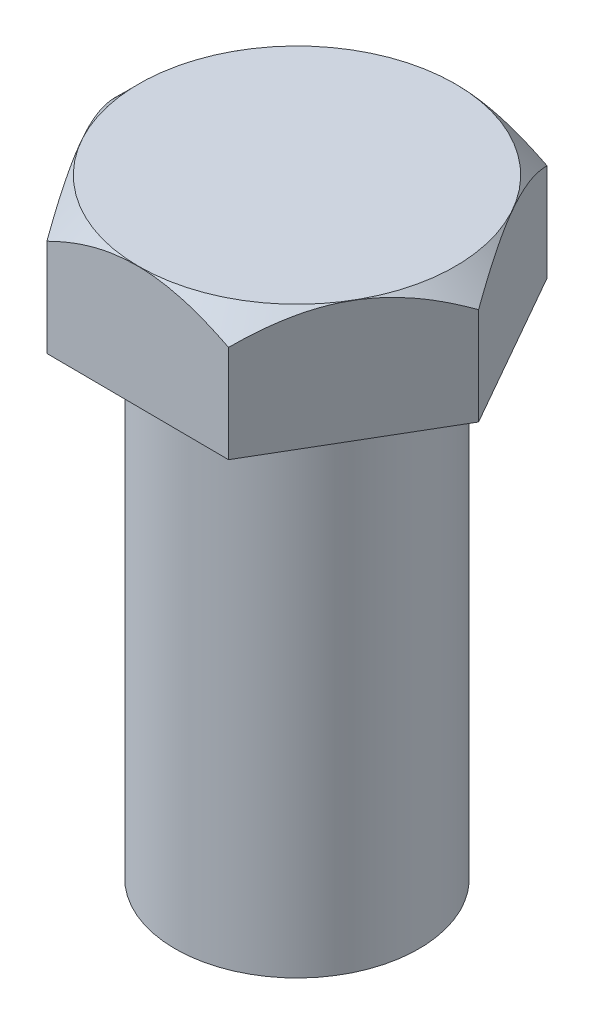
ISO-10303-21;
HEADER;
FILE_DESCRIPTION(('STEP AP214'),'2;1');
FILE_NAME('part.step','',(''),(''),'','','');
FILE_SCHEMA(('AUTOMOTIVE_DESIGN { 1 0 10303 214 1 1 1 1 }'));
ENDSEC;
DATA;
#1=APPLICATION_CONTEXT('core data for automotive mechanical design processes');
#2=APPLICATION_PROTOCOL_DEFINITION('international standard','automotive_design',2000,#1);
#3=PRODUCT_CONTEXT('',#1,'mechanical');
#4=PRODUCT('Part','Part','',(#3));
#5=PRODUCT_RELATED_PRODUCT_CATEGORY('part','',(#4));
#6=PRODUCT_DEFINITION_FORMATION('','',#4);
#7=PRODUCT_DEFINITION_CONTEXT('part definition',#1,'design');
#8=PRODUCT_DEFINITION('design','',#6,#7);
#9=PRODUCT_DEFINITION_SHAPE('','',#8);
#10=(LENGTH_UNIT() NAMED_UNIT(*) SI_UNIT(.MILLI.,.METRE.));
#11=(NAMED_UNIT(*) PLANE_ANGLE_UNIT() SI_UNIT($,.RADIAN.));
#12=(NAMED_UNIT(*) SI_UNIT($,.STERADIAN.) SOLID_ANGLE_UNIT());
#13=UNCERTAINTY_MEASURE_WITH_UNIT(LENGTH_MEASURE(1.E-05),#10,'distance_accuracy_value','');
#14=(GEOMETRIC_REPRESENTATION_CONTEXT(3) GLOBAL_UNCERTAINTY_ASSIGNED_CONTEXT((#13)) GLOBAL_UNIT_ASSIGNED_CONTEXT((#10,
#11,#12)) REPRESENTATION_CONTEXT('',''));
#15=CARTESIAN_POINT('',(0.,0.,0.));
#16=DIRECTION('',(0.,0.,1.));
#17=DIRECTION('',(1.,0.,0.));
#18=AXIS2_PLACEMENT_3D('',#15,#16,#17);
#19=CARTESIAN_POINT('',(-3.38741150898086,12.,1.92689991147024));
#20=DIRECTION('',(-0.869210198473838,0.,0.494442747817249));
#21=DIRECTION('',(0.494442747817249,0.,0.869210198473838));
#22=AXIS2_PLACEMENT_3D('',#19,#20,#21);
#23=PLANE('',#22);
#24=DIRECTION('',(0.,1.,0.));
#25=VECTOR('',#24,1.);
#26=CARTESIAN_POINT('',(-2.27491532639205,12.,3.88262285803638));
#27=LINE('',#26,#25);
#28=CARTESIAN_POINT('',(-2.27491532639205,12.,3.88262285803638));
#29=VERTEX_POINT('',#28);
#30=CARTESIAN_POINT('',(-2.27491532639205,14.395,3.88262285803638));
#31=VERTEX_POINT('',#30);
#32=EDGE_CURVE('E160',#29,#31,#27,.T.);
#33=ORIENTED_EDGE('',*,*,#32,.T.);
#34=CARTESIAN_POINT('',(-2.27480155811167,14.3948849486178,3.88282285803638));
#35=CARTESIAN_POINT('',(-2.31306092551852,14.4335703988287,3.81556444948655));
#36=CARTESIAN_POINT('',(-2.35161306696474,14.4710690009602,3.74779135610821));
#37=CARTESIAN_POINT('',(-2.42936320726318,14.543330733342,3.61110977835525));
#38=CARTESIAN_POINT('',(-2.46856154494327,14.5780923694987,3.54220069833503));
#39=CARTESIAN_POINT('',(-2.58758053977023,14.6780256287268,3.33297015633113));
#40=CARTESIAN_POINT('',(-2.6684127409146,14.7384192249591,3.19087044122773));
#41=CARTESIAN_POINT('',(-2.83138574638918,14.8418463965576,2.90437053995545));
#42=CARTESIAN_POINT('',(-2.91348538454957,14.8851404262662,2.76004272223528));
#43=CARTESIAN_POINT('',(-3.07949755410774,14.9518496625736,2.46820009437241));
#44=CARTESIAN_POINT('',(-3.16340500115676,14.9753146402362,2.32069422230757));
#45=CARTESIAN_POINT('',(-3.30801604965155,14.9964855742927,2.06647389302058));
#46=CARTESIAN_POINT('',(-3.3685333333993,14.9996188499743,1.96008697471772));
#47=CARTESIAN_POINT('',(-3.48946967878921,14.9943372000237,1.74748580857033));
#48=CARTESIAN_POINT('',(-3.54988869856692,14.9859182261118,1.64127163432182));
#49=CARTESIAN_POINT('',(-3.67015425679536,14.9580122881343,1.42984968466477));
#50=CARTESIAN_POINT('',(-3.73000007870121,14.9385129450965,1.32464316891295));
#51=CARTESIAN_POINT('',(-3.84866390388889,14.8895107015039,1.11603700065912));
#52=CARTESIAN_POINT('',(-3.90748198561205,14.8600085679409,1.01263721026045));
#53=CARTESIAN_POINT('',(-4.01189848083281,14.7993108167485,0.8290772674047));
#54=CARTESIAN_POINT('',(-4.05772806757026,14.7697110674808,0.74851072181396));
#55=CARTESIAN_POINT('',(-4.14856451254315,14.7057413233769,0.58882395380674));
#56=CARTESIAN_POINT('',(-4.19357134569815,14.6713711833958,0.509703775480655));
#57=CARTESIAN_POINT('',(-4.28262048578962,14.5986311550648,0.353159016609126));
#58=CARTESIAN_POINT('',(-4.32666532544825,14.5602738442614,0.275729983641334));
#59=CARTESIAN_POINT('',(-4.41393934111822,14.4800631676673,0.122305821153382));
#60=CARTESIAN_POINT('',(-4.45716899788176,14.4382119468201,0.0463098464904385));
#61=CARTESIAN_POINT('',(-4.50002145985004,14.3948849486178,-0.0290230350958886));
#62=B_SPLINE_CURVE_WITH_KNOTS('',3,(#34,#35,#36,#37,#38,#39,#40,#41,#42,#43,#44,#45,#46,#47,#48,
#49,#50,#51,#52,#53,#54,#55,#56,#57,#58,#59,#60,#61),.UNSPECIFIED.,.F.,.F.,(4,2,2,2,2,2,2,2,2,2,
2,2,2,4),(0.,0.259511356759491,0.519163410942877,1.04127110701184,1.55508749855843,
2.0676103438585,2.43439729579002,2.80131281449566,3.16863905888255,3.53593714387571,
3.82770299633271,4.11947772806444,4.41035848645958,4.70106196546155),.UNSPECIFIED.);
#63=CARTESIAN_POINT('',(-4.49990769156967,14.395,-0.0288230350958885));
#64=VERTEX_POINT('',#63);
#65=EDGE_CURVE('E80',#31,#64,#62,.T.);
#66=ORIENTED_EDGE('',*,*,#65,.T.);
#67=DIRECTION('',(0.,1.,0.));
#68=VECTOR('',#67,1.);
#69=CARTESIAN_POINT('',(-4.49990769156967,12.,-0.0288230350958887));
#70=LINE('',#69,#68);
#71=CARTESIAN_POINT('',(-4.49990769156967,12.,-0.0288230350958887));
#72=VERTEX_POINT('',#71);
#73=EDGE_CURVE('E159',#72,#64,#70,.T.);
#74=ORIENTED_EDGE('',*,*,#73,.F.);
#75=DIRECTION('',(0.494442747817249,0.,0.869210198473838));
#76=VECTOR('',#75,1.);
#77=CARTESIAN_POINT('',(-3.38741150898086,12.,1.92689991147024));
#78=LINE('',#77,#76);
#79=EDGE_CURVE('E156',#72,#29,#78,.T.);
#80=ORIENTED_EDGE('',*,*,#79,.T.);
#81=EDGE_LOOP('',(#33,#66,#74,#80));
#82=FACE_BOUND('',#81,.T.);
#83=ADVANCED_FACE('F60',(#82),#23,.T.);
#84=CARTESIAN_POINT('',(-3.36245002837364,12.,-1.97013446411408));
#85=DIRECTION('',(-0.862805079563639,0.,-0.505536739198233));
#86=DIRECTION('',(-0.505536739198233,0.,0.862805079563639));
#87=AXIS2_PLACEMENT_3D('',#84,#85,#86);
#88=PLANE('',#87);
#89=ORIENTED_EDGE('',*,*,#73,.T.);
#90=CARTESIAN_POINT('',(-4.50002487603025,14.3948840944894,-0.0286230350958887));
#91=CARTESIAN_POINT('',(-4.46090704327545,14.4335695924587,-0.0953858679137221));
#92=CARTESIAN_POINT('',(-4.42148986708007,14.4710682417424,-0.162659593454152));
#93=CARTESIAN_POINT('',(-4.34199516509972,14.5433300666852,-0.298334070398852));
#94=CARTESIAN_POINT('',(-4.30191729288356,14.5780917482476,-0.366735413060992));
#95=CARTESIAN_POINT('',(-4.18022774129432,14.6780251414279,-0.574424301127837));
#96=CARTESIAN_POINT('',(-4.09758182004704,14.7384188224181,-0.715476998446058));
#97=CARTESIAN_POINT('',(-3.93095201125394,14.8418461431297,-0.999865914791532));
#98=CARTESIAN_POINT('',(-3.84701021368965,14.8851402379352,-1.14313029838715));
#99=CARTESIAN_POINT('',(-3.67727304491054,14.951849578377,-1.4328225799919));
#100=CARTESIAN_POINT('',(-3.59148287214697,14.9753145952547,-1.57924160574747));
#101=CARTESIAN_POINT('',(-3.44362706594206,14.9964855619308,-1.83158872662912));
#102=CARTESIAN_POINT('',(-3.38175193144143,14.9996188472302,-1.93719169513047));
#103=CARTESIAN_POINT('',(-3.25810208792279,14.9943372154266,-2.14822623486409));
#104=CARTESIAN_POINT('',(-3.19632742170845,14.9859182500397,-2.25365773304286));
#105=CARTESIAN_POINT('',(-3.07336341509191,14.9580123274919,-2.46352174743775));
#106=CARTESIAN_POINT('',(-3.0121748073136,14.9385129913243,-2.56795301327668));
#107=CARTESIAN_POINT('',(-2.89084847180137,14.8895107596688,-2.77502199649403));
#108=CARTESIAN_POINT('',(-2.83071066386628,14.8600086311714,-2.87765985075268));
#109=CARTESIAN_POINT('',(-2.7239512463406,14.7993108391234,-3.05986731578974));
#110=CARTESIAN_POINT('',(-2.67709327805278,14.7697110344319,-3.1398403225407));
#111=CARTESIAN_POINT('',(-2.58421853290407,14.705741162503,-3.29835066543799));
#112=CARTESIAN_POINT('',(-2.53820178168818,14.6713709501104,-3.3768879578157));
#113=CARTESIAN_POINT('',(-2.44715445007757,14.5986307636867,-3.53227943404932));
#114=CARTESIAN_POINT('',(-2.40212128012663,14.5602733672285,-3.60913803752916));
#115=CARTESIAN_POINT('',(-2.31288890828269,14.4800625090866,-3.76143190208699));
#116=CARTESIAN_POINT('',(-2.26868921484499,14.4382111923702,-3.8368680020897));
#117=CARTESIAN_POINT('',(-2.22487518071703,14.3948840944894,-3.91164589313227));
#118=B_SPLINE_CURVE_WITH_KNOTS('',3,(#90,#91,#92,#93,#94,#95,#96,#97,#98,#99,#100,#101,#102,
#103,#104,#105,#106,#107,#108,#109,#110,#111,#112,#113,#114,#115,#116,#117),.UNSPECIFIED.,.F.,
.F.,(4,2,2,2,2,2,2,2,2,2,2,2,2,4),(0.,0.259511559008754,0.519163815738846,1.04127192562337,
1.55508870956662,2.06761194333773,2.43439891080444,2.80131444517624,3.16864070633625,
3.53593880815574,3.82770519922407,4.1194804701856,4.41036176719606,4.70106578305072),.UNSPECIFIED.);
#119=CARTESIAN_POINT('',(-2.22499236517762,14.395,-3.91144589313227));
#120=VERTEX_POINT('',#119);
#121=EDGE_CURVE('E196',#64,#120,#118,.T.);
#122=ORIENTED_EDGE('',*,*,#121,.T.);
#123=DIRECTION('',(0.,1.,0.));
#124=VECTOR('',#123,1.);
#125=CARTESIAN_POINT('',(-2.22499236517762,12.,-3.91144589313227));
#126=LINE('',#125,#124);
#127=CARTESIAN_POINT('',(-2.22499236517762,12.,-3.91144589313227));
#128=VERTEX_POINT('',#127);
#129=EDGE_CURVE('E152',#128,#120,#126,.T.);
#130=ORIENTED_EDGE('',*,*,#129,.F.);
#131=DIRECTION('',(-0.505536739198233,0.,0.862805079563639));
#132=VECTOR('',#131,1.);
#133=CARTESIAN_POINT('',(-3.36245002837364,12.,-1.97013446411408));
#134=LINE('',#133,#132);
#135=EDGE_CURVE('E87',#128,#72,#134,.T.);
#136=ORIENTED_EDGE('',*,*,#135,.T.);
#137=EDGE_LOOP('',(#89,#122,#130,#136));
#138=FACE_BOUND('',#137,.T.);
#139=ADVANCED_FACE('F180',(#138),#88,.T.);
#140=CARTESIAN_POINT('',(0.0249614806072157,12.,-3.89703437558432));
#141=DIRECTION('',(0.00640511891019895,0.,-0.999979487015482));
#142=DIRECTION('',(-0.999979487015482,0.,-0.00640511891019895));
#143=AXIS2_PLACEMENT_3D('',#140,#141,#142);
#144=PLANE('',#143);
#145=ORIENTED_EDGE('',*,*,#129,.T.);
#146=CARTESIAN_POINT('',(-2.22519236517762,14.3948999946153,-3.91144717418233));
#147=CARTESIAN_POINT('',(-2.14781609825965,14.4335846035393,-3.91095155982536));
#148=CARTESIAN_POINT('',(-2.0698477254691,14.4710823750586,-3.91045215288208));
#149=CARTESIAN_POINT('',(-1.91260480323778,14.5433424769289,-3.90944497260712));
#150=CARTESIAN_POINT('',(-1.83332956857017,14.5781033132387,-3.90893719488641));
#151=CARTESIAN_POINT('',(-1.59262404669533,14.6780342128272,-3.90739541576997));
#152=CARTESIAN_POINT('',(-1.42914802727215,14.7384263160017,-3.90634831094735));
#153=CARTESIAN_POINT('',(-1.09954947299966,14.841850860887,-3.90423714970839));
#154=CARTESIAN_POINT('',(-0.93351018887359,14.8851437438743,-3.90317362653376));
#155=CARTESIAN_POINT('',(-0.597765292438725,14.9518511457845,-3.90102309643481));
#156=CARTESIAN_POINT('',(-0.428069962100611,14.9753154326429,-3.89993615536909));
#157=CARTESIAN_POINT('',(-0.135605513677783,14.9964857920651,-3.8980628473728));
#158=CARTESIAN_POINT('',(-0.0132131848148659,14.9996188983138,-3.89727889387151));
#159=CARTESIAN_POINT('',(0.23137280854664,14.9943369286694,-3.89571225936391));
#160=CARTESIAN_POINT('',(0.353566388372993,14.9859178045729,-3.89492957889994));
#161=CARTESIAN_POINT('',(0.596795723460335,14.9580115947674,-3.89337163412816));
#162=CARTESIAN_POINT('',(0.717830029610178,14.9385121306962,-3.89259637910227));
#163=CARTESIAN_POINT('',(0.95781993897169,14.8895096767992,-3.89105918366309));
#164=CARTESIAN_POINT('',(1.07677570083174,14.860007453989,-3.89029724223363));
#165=CARTESIAN_POINT('',(1.28794833354216,14.7993104224913,-3.8889446286644));
#166=CARTESIAN_POINT('',(1.38063278868152,14.7697116495567,-3.88835096153022));
#167=CARTESIAN_POINT('',(1.56433788896369,14.7057441571848,-3.88717428438134));
#168=CARTESIAN_POINT('',(1.65535848344682,14.6713752927851,-3.88659127469113));
#169=CARTESIAN_POINT('',(1.83544908928129,14.5986380493729,-3.88543774928391));
#170=CARTESIAN_POINT('',(1.92452422267985,14.5602822474425,-3.88486720075889));
#171=CARTESIAN_POINT('',(2.10102496779205,14.480074768946,-3.88373666930814));
#172=CARTESIAN_POINT('',(2.18845155159893,14.4382252369052,-3.88317668015589));
#173=CARTESIAN_POINT('',(2.27511532639204,14.3948999946153,-3.88262157698631));
#174=B_SPLINE_CURVE_WITH_KNOTS('',3,(#146,#147,#148,#149,#150,#151,#152,#153,#154,#155,#156,
#157,#158,#159,#160,#161,#162,#163,#164,#165,#166,#167,#168,#169,#170,#171,#172,#173),
.UNSPECIFIED.,.F.,.F.,(4,2,2,2,2,2,2,2,2,2,2,2,2,4),(0.,0.259507794039297,0.519156280262991,
1.04125668677009,1.55506616605299,2.06758216823974,2.4343688465297,2.80128408928681,
3.16861003822499,3.53590782683231,3.82766419117663,4.11942942390167,4.41030069411634,
4.7009947159864),.UNSPECIFIED.);
#175=CARTESIAN_POINT('',(2.27491532639204,14.395,-3.88262285803638));
#176=VERTEX_POINT('',#175);
#177=EDGE_CURVE('E218',#120,#176,#174,.T.);
#178=ORIENTED_EDGE('',*,*,#177,.T.);
#179=DIRECTION('',(0.,1.,0.));
#180=VECTOR('',#179,1.);
#181=CARTESIAN_POINT('',(2.27491532639204,12.,-3.88262285803638));
#182=LINE('',#181,#180);
#183=CARTESIAN_POINT('',(2.27491532639204,12.,-3.88262285803638));
#184=VERTEX_POINT('',#183);
#185=EDGE_CURVE('E147',#184,#176,#182,.T.);
#186=ORIENTED_EDGE('',*,*,#185,.F.);
#187=DIRECTION('',(-0.999979487015482,0.,-0.00640511891019895));
#188=VECTOR('',#187,1.);
#189=CARTESIAN_POINT('',(0.0249614806072157,12.,-3.89703437558432));
#190=LINE('',#189,#188);
#191=EDGE_CURVE('E150',#184,#128,#190,.T.);
#192=ORIENTED_EDGE('',*,*,#191,.T.);
#193=EDGE_LOOP('',(#145,#178,#186,#192));
#194=FACE_BOUND('',#193,.T.);
#195=ADVANCED_FACE('F186',(#194),#144,.T.);
#196=CARTESIAN_POINT('',(3.38741150898086,12.,-1.92689991147024));
#197=DIRECTION('',(0.869210198473838,0.,-0.494442747817249));
#198=DIRECTION('',(-0.494442747817249,0.,-0.869210198473838));
#199=AXIS2_PLACEMENT_3D('',#196,#197,#198);
#200=PLANE('',#199);
#201=ORIENTED_EDGE('',*,*,#185,.T.);
#202=CARTESIAN_POINT('',(2.27480155811167,14.3948849486178,-3.88282285803638));
#203=CARTESIAN_POINT('',(2.31306092551852,14.4335703988287,-3.81556444948655));
#204=CARTESIAN_POINT('',(2.35161306696474,14.4710690009602,-3.74779135610822));
#205=CARTESIAN_POINT('',(2.42936320726318,14.543330733342,-3.61110977835525));
#206=CARTESIAN_POINT('',(2.46856154494326,14.5780923694987,-3.54220069833503));
#207=CARTESIAN_POINT('',(2.58758053977023,14.6780256287268,-3.33297015633113));
#208=CARTESIAN_POINT('',(2.6684127409146,14.7384192249591,-3.19087044122773));
#209=CARTESIAN_POINT('',(2.83138574638917,14.8418463965576,-2.90437053995546));
#210=CARTESIAN_POINT('',(2.91348538454957,14.8851404262662,-2.76004272223528));
#211=CARTESIAN_POINT('',(3.07949755410773,14.9518496625736,-2.46820009437242));
#212=CARTESIAN_POINT('',(3.16340500115676,14.9753146402362,-2.32069422230757));
#213=CARTESIAN_POINT('',(3.30801604965155,14.9964855742927,-2.06647389302058));
#214=CARTESIAN_POINT('',(3.3685333333993,14.9996188499743,-1.96008697471772));
#215=CARTESIAN_POINT('',(3.48946967878921,14.9943372000237,-1.74748580857033));
#216=CARTESIAN_POINT('',(3.54988869856691,14.9859182261118,-1.64127163432182));
#217=CARTESIAN_POINT('',(3.67015425679536,14.9580122881343,-1.42984968466477));
#218=CARTESIAN_POINT('',(3.7300000787012,14.9385129450965,-1.32464316891295));
#219=CARTESIAN_POINT('',(3.84866390388888,14.8895107015039,-1.11603700065913));
#220=CARTESIAN_POINT('',(3.90748198561205,14.8600085679409,-1.01263721026046));
#221=CARTESIAN_POINT('',(4.01189848083281,14.7993108167485,-0.829077267404702));
#222=CARTESIAN_POINT('',(4.05772806757025,14.7697110674808,-0.74851072181396));
#223=CARTESIAN_POINT('',(4.14856451254315,14.7057413233769,-0.58882395380674));
#224=CARTESIAN_POINT('',(4.19357134569815,14.6713711833958,-0.509703775480656));
#225=CARTESIAN_POINT('',(4.28262048578962,14.5986311550648,-0.353159016609127));
#226=CARTESIAN_POINT('',(4.32666532544825,14.5602738442614,-0.275729983641335));
#227=CARTESIAN_POINT('',(4.41393934111822,14.4800631676673,-0.122305821153384));
#228=CARTESIAN_POINT('',(4.45716899788176,14.4382119468201,-0.0463098464904401));
#229=CARTESIAN_POINT('',(4.50002145985003,14.3948849486178,0.0290230350958867));
#230=B_SPLINE_CURVE_WITH_KNOTS('',3,(#202,#203,#204,#205,#206,#207,#208,#209,#210,#211,#212,
#213,#214,#215,#216,#217,#218,#219,#220,#221,#222,#223,#224,#225,#226,#227,#228,#229),
.UNSPECIFIED.,.F.,.F.,(4,2,2,2,2,2,2,2,2,2,2,2,2,4),(0.,0.259511356759491,0.519163410942878,
1.04127110701184,1.55508749855843,2.0676103438585,2.43439729579002,2.80131281449565,
3.16863905888255,3.53593714387571,3.82770299633271,4.11947772806444,4.41035848645958,
4.70106196546155),.UNSPECIFIED.);
#231=CARTESIAN_POINT('',(4.49990769156967,14.395,0.0288230350958868));
#232=VERTEX_POINT('',#231);
#233=EDGE_CURVE('E132',#176,#232,#230,.T.);
#234=ORIENTED_EDGE('',*,*,#233,.T.);
#235=DIRECTION('',(0.,1.,0.));
#236=VECTOR('',#235,1.);
#237=CARTESIAN_POINT('',(4.49990769156967,12.,0.0288230350958866));
#238=LINE('',#237,#236);
#239=CARTESIAN_POINT('',(4.49990769156967,12.,0.0288230350958866));
#240=VERTEX_POINT('',#239);
#241=EDGE_CURVE('E131',#240,#232,#238,.T.);
#242=ORIENTED_EDGE('',*,*,#241,.F.);
#243=DIRECTION('',(-0.494442747817249,0.,-0.869210198473838));
#244=VECTOR('',#243,1.);
#245=CARTESIAN_POINT('',(3.38741150898086,12.,-1.92689991147024));
#246=LINE('',#245,#244);
#247=EDGE_CURVE('E145',#240,#184,#246,.T.);
#248=ORIENTED_EDGE('',*,*,#247,.T.);
#249=EDGE_LOOP('',(#201,#234,#242,#248));
#250=FACE_BOUND('',#249,.T.);
#251=ADVANCED_FACE('F225',(#250),#200,.T.);
#252=CARTESIAN_POINT('',(3.36245002837364,12.,1.97013446411408));
#253=DIRECTION('',(0.862805079563639,0.,0.505536739198233));
#254=DIRECTION('',(0.505536739198233,0.,-0.862805079563639));
#255=AXIS2_PLACEMENT_3D('',#252,#253,#254);
#256=PLANE('',#255);
#257=ORIENTED_EDGE('',*,*,#241,.T.);
#258=CARTESIAN_POINT('',(4.50002487603025,14.3948840944894,0.0286230350958866));
#259=CARTESIAN_POINT('',(4.46090704327545,14.4335695924587,0.0953858679137199));
#260=CARTESIAN_POINT('',(4.42148986708008,14.4710682417424,0.16265959345415));
#261=CARTESIAN_POINT('',(4.34199516509972,14.5433300666852,0.29833407039885));
#262=CARTESIAN_POINT('',(4.30191729288356,14.5780917482476,0.36673541306099));
#263=CARTESIAN_POINT('',(4.18022774129432,14.6780251414279,0.574424301127834));
#264=CARTESIAN_POINT('',(4.09758182004704,14.7384188224181,0.715476998446056));
#265=CARTESIAN_POINT('',(3.93095201125394,14.8418461431297,0.999865914791531));
#266=CARTESIAN_POINT('',(3.84701021368965,14.8851402379352,1.14313029838714));
#267=CARTESIAN_POINT('',(3.67727304491054,14.951849578377,1.4328225799919));
#268=CARTESIAN_POINT('',(3.59148287214697,14.9753145952547,1.57924160574747));
#269=CARTESIAN_POINT('',(3.44362706594206,14.9964855619308,1.83158872662912));
#270=CARTESIAN_POINT('',(3.38175193144143,14.9996188472302,1.93719169513047));
#271=CARTESIAN_POINT('',(3.25810208792279,14.9943372154266,2.14822623486409));
#272=CARTESIAN_POINT('',(3.19632742170845,14.9859182500397,2.25365773304286));
#273=CARTESIAN_POINT('',(3.07336341509191,14.9580123274919,2.46352174743775));
#274=CARTESIAN_POINT('',(3.0121748073136,14.9385129913243,2.56795301327668));
#275=CARTESIAN_POINT('',(2.89084847180137,14.8895107596688,2.77502199649403));
#276=CARTESIAN_POINT('',(2.83071066386628,14.8600086311714,2.87765985075268));
#277=CARTESIAN_POINT('',(2.7239512463406,14.7993108391234,3.05986731578974));
#278=CARTESIAN_POINT('',(2.67709327805278,14.7697110344319,3.1398403225407));
#279=CARTESIAN_POINT('',(2.58421853290407,14.705741162503,3.298350665438));
#280=CARTESIAN_POINT('',(2.53820178168818,14.6713709501104,3.3768879578157));
#281=CARTESIAN_POINT('',(2.44715445007757,14.5986307636867,3.53227943404933));
#282=CARTESIAN_POINT('',(2.40212128012663,14.5602733672285,3.60913803752916));
#283=CARTESIAN_POINT('',(2.31288890828269,14.4800625090866,3.761431902087));
#284=CARTESIAN_POINT('',(2.26868921484499,14.4382111923702,3.83686800208971));
#285=CARTESIAN_POINT('',(2.22487518071703,14.3948840944894,3.91164589313227));
#286=B_SPLINE_CURVE_WITH_KNOTS('',3,(#258,#259,#260,#261,#262,#263,#264,#265,#266,#267,#268,
#269,#270,#271,#272,#273,#274,#275,#276,#277,#278,#279,#280,#281,#282,#283,#284,#285),
.UNSPECIFIED.,.F.,.F.,(4,2,2,2,2,2,2,2,2,2,2,2,2,4),(0.,0.259511559008756,0.519163815738847,
1.04127192562337,1.55508870956662,2.06761194333773,2.43439891080445,2.80131444517624,
3.16864070633626,3.53593880815574,3.82770519922408,4.11948047018561,4.41036176719607,
4.70106578305073),.UNSPECIFIED.);
#287=CARTESIAN_POINT('',(2.22499236517761,14.395,3.91144589313227));
#288=VERTEX_POINT('',#287);
#289=EDGE_CURVE('E119',#232,#288,#286,.T.);
#290=ORIENTED_EDGE('',*,*,#289,.T.);
#291=DIRECTION('',(0.,1.,0.));
#292=VECTOR('',#291,1.);
#293=CARTESIAN_POINT('',(2.22499236517761,12.,3.91144589313227));
#294=LINE('',#293,#292);
#295=CARTESIAN_POINT('',(2.22499236517761,12.,3.91144589313227));
#296=VERTEX_POINT('',#295);
#297=EDGE_CURVE('E128',#296,#288,#294,.T.);
#298=ORIENTED_EDGE('',*,*,#297,.F.);
#299=DIRECTION('',(0.505536739198233,0.,-0.862805079563639));
#300=VECTOR('',#299,1.);
#301=CARTESIAN_POINT('',(3.36245002837364,12.,1.97013446411408));
#302=LINE('',#301,#300);
#303=EDGE_CURVE('E138',#296,#240,#302,.T.);
#304=ORIENTED_EDGE('',*,*,#303,.T.);
#305=EDGE_LOOP('',(#257,#290,#298,#304));
#306=FACE_BOUND('',#305,.T.);
#307=ADVANCED_FACE('F127',(#306),#256,.T.);
#308=CARTESIAN_POINT('',(-0.0249614806072165,12.,3.89703437558432));
#309=DIRECTION('',(-0.00640511891019914,0.,0.999979487015482));
#310=DIRECTION('',(0.999979487015482,0.,0.00640511891019914));
#311=AXIS2_PLACEMENT_3D('',#308,#309,#310);
#312=PLANE('',#311);
#313=ORIENTED_EDGE('',*,*,#297,.T.);
#314=CARTESIAN_POINT('',(2.22519236517761,14.3948999946153,3.91144717418233));
#315=CARTESIAN_POINT('',(2.14781609825964,14.4335846035393,3.91095155982536));
#316=CARTESIAN_POINT('',(2.06984772546909,14.4710823750586,3.91045215288208));
#317=CARTESIAN_POINT('',(1.91260480323777,14.5433424769289,3.90944497260712));
#318=CARTESIAN_POINT('',(1.83332956857016,14.5781033132387,3.90893719488641));
#319=CARTESIAN_POINT('',(1.59262404669533,14.6780342128272,3.90739541576997));
#320=CARTESIAN_POINT('',(1.42914802727214,14.7384263160017,3.90634831094735));
#321=CARTESIAN_POINT('',(1.09954947299965,14.8418508608871,3.90423714970839));
#322=CARTESIAN_POINT('',(0.933510188873584,14.8851437438743,3.90317362653376));
#323=CARTESIAN_POINT('',(0.597765292438721,14.9518511457845,3.90102309643481));
#324=CARTESIAN_POINT('',(0.428069962100608,14.9753154326429,3.89993615536909));
#325=CARTESIAN_POINT('',(0.13560551367778,14.9964857920651,3.89806284737279));
#326=CARTESIAN_POINT('',(0.013213184814863,14.9996188983138,3.89727889387151));
#327=CARTESIAN_POINT('',(-0.231372808546643,14.9943369286694,3.89571225936391));
#328=CARTESIAN_POINT('',(-0.353566388372995,14.9859178045729,3.89492957889994));
#329=CARTESIAN_POINT('',(-0.596795723460337,14.9580115947674,3.89337163412816));
#330=CARTESIAN_POINT('',(-0.71783002961018,14.9385121306962,3.89259637910227));
#331=CARTESIAN_POINT('',(-0.957819938971692,14.8895096767992,3.89105918366309));
#332=CARTESIAN_POINT('',(-1.07677570083174,14.860007453989,3.89029724223363));
#333=CARTESIAN_POINT('',(-1.28794833354216,14.7993104224913,3.8889446286644));
#334=CARTESIAN_POINT('',(-1.38063278868152,14.7697116495566,3.88835096153022));
#335=CARTESIAN_POINT('',(-1.5643378889637,14.7057441571848,3.88717428438134));
#336=CARTESIAN_POINT('',(-1.65535848344682,14.6713752927851,3.88659127469113));
#337=CARTESIAN_POINT('',(-1.83544908928129,14.5986380493729,3.88543774928391));
#338=CARTESIAN_POINT('',(-1.92452422267985,14.5602822474425,3.88486720075889));
#339=CARTESIAN_POINT('',(-2.10102496779206,14.480074768946,3.88373666930814));
#340=CARTESIAN_POINT('',(-2.18845155159893,14.4382252369052,3.88317668015589));
#341=CARTESIAN_POINT('',(-2.27511532639205,14.3948999946153,3.88262157698631));
#342=B_SPLINE_CURVE_WITH_KNOTS('',3,(#314,#315,#316,#317,#318,#319,#320,#321,#322,#323,#324,
#325,#326,#327,#328,#329,#330,#331,#332,#333,#334,#335,#336,#337,#338,#339,#340,#341),
.UNSPECIFIED.,.F.,.F.,(4,2,2,2,2,2,2,2,2,2,2,2,2,4),(0.,0.259507794039296,0.51915628026299,
1.04125668677008,1.55506616605299,2.06758216823973,2.43436884652969,2.8012840892868,
3.16861003822498,3.5359078268323,3.82766419117662,4.11942942390166,4.41030069411633,
4.70099471598639),.UNSPECIFIED.);
#343=EDGE_CURVE('E13',#288,#31,#342,.T.);
#344=ORIENTED_EDGE('',*,*,#343,.T.);
#345=ORIENTED_EDGE('',*,*,#32,.F.);
#346=DIRECTION('',(0.999979487015482,0.,0.00640511891019914));
#347=VECTOR('',#346,1.);
#348=CARTESIAN_POINT('',(-0.0249614806072165,12.,3.89703437558432));
#349=LINE('',#348,#347);
#350=EDGE_CURVE('E137',#29,#296,#349,.T.);
#351=ORIENTED_EDGE('',*,*,#350,.T.);
#352=EDGE_LOOP('',(#313,#344,#345,#351));
#353=FACE_BOUND('',#352,.T.);
#354=ADVANCED_FACE('F135',(#353),#312,.T.);
#355=CARTESIAN_POINT('',(0.,12.,0.));
#356=DIRECTION('',(0.,1.,0.));
#357=DIRECTION('',(0.,0.,1.));
#358=AXIS2_PLACEMENT_3D('',#355,#356,#357);
#359=PLANE('',#358);
#360=CARTESIAN_POINT('',(0.,12.,0.));
#361=DIRECTION('',(0.,1.,0.));
#362=DIRECTION('',(0.,0.,1.));
#363=AXIS2_PLACEMENT_3D('',#360,#361,#362);
#364=CIRCLE('',#363,3.);
#365=CARTESIAN_POINT('',(0.,12.,3.));
#366=VERTEX_POINT('',#365);
#367=EDGE_CURVE('E73',#366,#366,#364,.T.);
#368=ORIENTED_EDGE('',*,*,#367,.T.);
#369=EDGE_LOOP('',(#368));
#370=FACE_BOUND('',#369,.T.);
#371=ORIENTED_EDGE('',*,*,#350,.F.);
#372=ORIENTED_EDGE('',*,*,#79,.F.);
#373=ORIENTED_EDGE('',*,*,#135,.F.);
#374=ORIENTED_EDGE('',*,*,#191,.F.);
#375=ORIENTED_EDGE('',*,*,#247,.F.);
#376=ORIENTED_EDGE('',*,*,#303,.F.);
#377=EDGE_LOOP('',(#371,#372,#373,#374,#375,#376));
#378=FACE_BOUND('',#377,.T.);
#379=ADVANCED_FACE('F176',(#370,#378),#359,.F.);
#380=CARTESIAN_POINT('',(0.,12.,0.));
#381=DIRECTION('',(0.,-1.,0.));
#382=DIRECTION('',(0.,0.,-1.));
#383=AXIS2_PLACEMENT_3D('',#380,#381,#382);
#384=CYLINDRICAL_SURFACE('',#383,3.);
#385=ORIENTED_EDGE('',*,*,#367,.F.);
#386=EDGE_LOOP('',(#385));
#387=FACE_BOUND('',#386,.T.);
#388=CARTESIAN_POINT('',(0.,0.,0.));
#389=DIRECTION('',(0.,1.,0.));
#390=DIRECTION('',(0.,0.,1.));
#391=AXIS2_PLACEMENT_3D('',#388,#389,#390);
#392=CIRCLE('',#391,3.);
#393=CARTESIAN_POINT('',(0.,0.,3.));
#394=VERTEX_POINT('',#393);
#395=EDGE_CURVE('E162',#394,#394,#392,.T.);
#396=ORIENTED_EDGE('',*,*,#395,.T.);
#397=EDGE_LOOP('',(#396));
#398=FACE_BOUND('',#397,.T.);
#399=ADVANCED_FACE('F62',(#387,#398),#384,.T.);
#400=CARTESIAN_POINT('',(0.,0.,0.));
#401=DIRECTION('',(0.,1.,0.));
#402=DIRECTION('',(0.,0.,1.));
#403=AXIS2_PLACEMENT_3D('',#400,#401,#402);
#404=PLANE('',#403);
#405=ORIENTED_EDGE('',*,*,#395,.F.);
#406=EDGE_LOOP('',(#405));
#407=FACE_BOUND('',#406,.T.);
#408=ADVANCED_FACE('F169',(#407),#404,.F.);
#409=CARTESIAN_POINT('',(0.,15.,0.));
#410=DIRECTION('',(0.,-1.,0.));
#411=DIRECTION('',(0.,0.,1.));
#412=AXIS2_PLACEMENT_3D('',#409,#410,#411);
#413=CONICAL_SURFACE('',#412,3.895,0.78539816339745);
#414=ORIENTED_EDGE('',*,*,#343,.F.);
#415=ORIENTED_EDGE('',*,*,#289,.F.);
#416=ORIENTED_EDGE('',*,*,#233,.F.);
#417=ORIENTED_EDGE('',*,*,#177,.F.);
#418=ORIENTED_EDGE('',*,*,#121,.F.);
#419=ORIENTED_EDGE('',*,*,#65,.F.);
#420=EDGE_LOOP('',(#414,#415,#416,#417,#418,#419));
#421=FACE_BOUND('',#420,.T.);
#422=CARTESIAN_POINT('',(0.,15.,0.));
#423=DIRECTION('',(0.,1.,0.));
#424=DIRECTION('',(0.,0.,1.));
#425=AXIS2_PLACEMENT_3D('',#422,#423,#424);
#426=CIRCLE('',#425,3.895);
#427=CARTESIAN_POINT('',(0.,15.,3.895));
#428=VERTEX_POINT('',#427);
#429=EDGE_CURVE('E133',#428,#428,#426,.T.);
#430=ORIENTED_EDGE('',*,*,#429,.F.);
#431=EDGE_LOOP('',(#430));
#432=FACE_BOUND('',#431,.T.);
#433=ADVANCED_FACE('F117',(#421,#432),#413,.T.);
#434=CARTESIAN_POINT('',(0.,15.,0.));
#435=DIRECTION('',(0.,1.,0.));
#436=DIRECTION('',(0.,0.,1.));
#437=AXIS2_PLACEMENT_3D('',#434,#435,#436);
#438=PLANE('',#437);
#439=ORIENTED_EDGE('',*,*,#429,.T.);
#440=EDGE_LOOP('',(#439));
#441=FACE_BOUND('',#440,.T.);
#442=ADVANCED_FACE('F175',(#441),#438,.T.);
#443=CLOSED_SHELL('',(#83,#139,#195,#251,#307,#354,#379,#399,#408,#433,#442));
#444=MANIFOLD_SOLID_BREP('B2',#443);
#445=ADVANCED_BREP_SHAPE_REPRESENTATION('',(#18,#444),#14);
#446=SHAPE_DEFINITION_REPRESENTATION(#9,#445);
ENDSEC;
END-ISO-10303-21;
